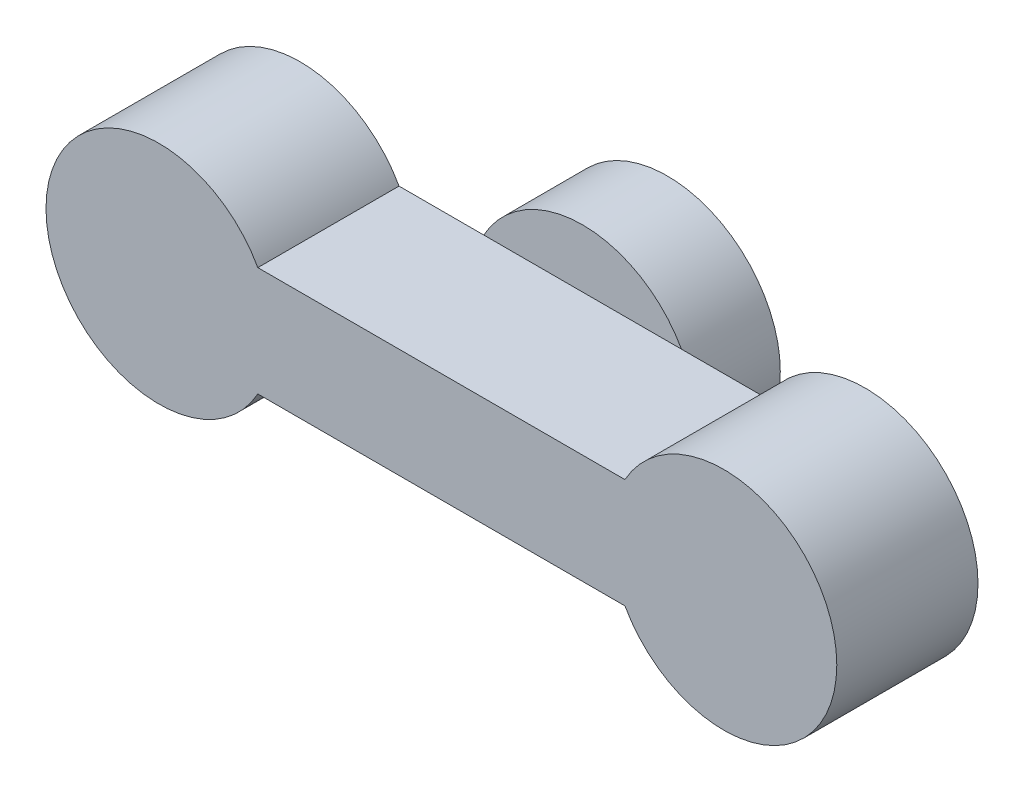
ISO-10303-21;
HEADER;
FILE_DESCRIPTION(('STEP AP214'),'2;1');
FILE_NAME('part.step','',(''),(''),'','','');
FILE_SCHEMA(('AUTOMOTIVE_DESIGN { 1 0 10303 214 1 1 1 1 }'));
ENDSEC;
DATA;
#1=APPLICATION_CONTEXT('core data for automotive mechanical design processes');
#2=APPLICATION_PROTOCOL_DEFINITION('international standard','automotive_design',2000,#1);
#3=PRODUCT_CONTEXT('',#1,'mechanical');
#4=PRODUCT('Part','Part','',(#3));
#5=PRODUCT_RELATED_PRODUCT_CATEGORY('part','',(#4));
#6=PRODUCT_DEFINITION_FORMATION('','',#4);
#7=PRODUCT_DEFINITION_CONTEXT('part definition',#1,'design');
#8=PRODUCT_DEFINITION('design','',#6,#7);
#9=PRODUCT_DEFINITION_SHAPE('','',#8);
#10=(LENGTH_UNIT() NAMED_UNIT(*) SI_UNIT(.MILLI.,.METRE.));
#11=(NAMED_UNIT(*) PLANE_ANGLE_UNIT() SI_UNIT($,.RADIAN.));
#12=(NAMED_UNIT(*) SI_UNIT($,.STERADIAN.) SOLID_ANGLE_UNIT());
#13=UNCERTAINTY_MEASURE_WITH_UNIT(LENGTH_MEASURE(1.E-05),#10,'distance_accuracy_value','');
#14=(GEOMETRIC_REPRESENTATION_CONTEXT(3) GLOBAL_UNCERTAINTY_ASSIGNED_CONTEXT((#13)) GLOBAL_UNIT_ASSIGNED_CONTEXT((#10,
#11,#12)) REPRESENTATION_CONTEXT('',''));
#15=CARTESIAN_POINT('',(0.,0.,0.));
#16=DIRECTION('',(0.,0.,1.));
#17=DIRECTION('',(1.,0.,0.));
#18=AXIS2_PLACEMENT_3D('',#15,#16,#17);
#19=CARTESIAN_POINT('',(0.,0.,1.5));
#20=DIRECTION('',(0.,0.,1.));
#21=DIRECTION('',(1.,0.,0.));
#22=AXIS2_PLACEMENT_3D('',#19,#20,#21);
#23=PLANE('',#22);
#24=DIRECTION('',(-1.,0.,0.));
#25=VECTOR('',#24,1.);
#26=CARTESIAN_POINT('',(3.25,0.968245836551854,1.5));
#27=LINE('',#26,#25);
#28=CARTESIAN_POINT('',(1.75,0.968245836551854,1.5));
#29=VERTEX_POINT('',#28);
#30=CARTESIAN_POINT('',(-1.75,0.968245836551854,1.5));
#31=VERTEX_POINT('',#30);
#32=EDGE_CURVE('E11',#29,#31,#27,.T.);
#33=ORIENTED_EDGE('',*,*,#32,.F.);
#34=CARTESIAN_POINT('',(0.,0.,1.5));
#35=DIRECTION('',(0.,0.,1.));
#36=DIRECTION('',(1.,0.,0.));
#37=AXIS2_PLACEMENT_3D('',#34,#35,#36);
#38=CIRCLE('',#37,2.);
#39=EDGE_CURVE('E136',#29,#31,#38,.T.);
#40=ORIENTED_EDGE('',*,*,#39,.T.);
#41=EDGE_LOOP('',(#33,#40));
#42=FACE_BOUND('',#41,.T.);
#43=ADVANCED_FACE('F43',(#42),#23,.T.);
#44=CARTESIAN_POINT('',(0.,0.,0.));
#45=DIRECTION('',(0.,0.,1.));
#46=DIRECTION('',(1.,0.,0.));
#47=AXIS2_PLACEMENT_3D('',#44,#45,#46);
#48=PLANE('',#47);
#49=CARTESIAN_POINT('',(0.,0.,0.));
#50=DIRECTION('',(0.,0.,1.));
#51=DIRECTION('',(1.,0.,0.));
#52=AXIS2_PLACEMENT_3D('',#49,#50,#51);
#53=CIRCLE('',#52,2.);
#54=CARTESIAN_POINT('',(2.,0.,0.));
#55=VERTEX_POINT('',#54);
#56=EDGE_CURVE('E47',#55,#55,#53,.T.);
#57=ORIENTED_EDGE('',*,*,#56,.F.);
#58=EDGE_LOOP('',(#57));
#59=FACE_BOUND('',#58,.T.);
#60=CARTESIAN_POINT('',(0.,0.,0.));
#61=DIRECTION('',(0.,0.,1.));
#62=DIRECTION('',(1.,0.,0.));
#63=AXIS2_PLACEMENT_3D('',#60,#61,#62);
#64=CIRCLE('',#63,1.);
#65=CARTESIAN_POINT('',(1.,0.,0.));
#66=VERTEX_POINT('',#65);
#67=EDGE_CURVE('E145',#66,#66,#64,.T.);
#68=ORIENTED_EDGE('',*,*,#67,.T.);
#69=EDGE_LOOP('',(#68));
#70=FACE_BOUND('',#69,.T.);
#71=ADVANCED_FACE('F208',(#59,#70),#48,.F.);
#72=CARTESIAN_POINT('',(0.,0.,1.));
#73=DIRECTION('',(0.,0.,-1.));
#74=DIRECTION('',(-1.,0.,0.));
#75=AXIS2_PLACEMENT_3D('',#72,#73,#74);
#76=CYLINDRICAL_SURFACE('',#75,2.);
#77=ORIENTED_EDGE('',*,*,#56,.T.);
#78=EDGE_LOOP('',(#77));
#79=FACE_BOUND('',#78,.T.);
#80=ORIENTED_EDGE('',*,*,#39,.F.);
#81=CARTESIAN_POINT('',(1.75,-0.968245836551854,1.5));
#82=VERTEX_POINT('',#81);
#83=EDGE_CURVE('E129',#82,#29,#38,.T.);
#84=ORIENTED_EDGE('',*,*,#83,.F.);
#85=CARTESIAN_POINT('',(-1.75,-0.968245836551854,1.5));
#86=VERTEX_POINT('',#85);
#87=EDGE_CURVE('E134',#86,#82,#38,.T.);
#88=ORIENTED_EDGE('',*,*,#87,.F.);
#89=EDGE_CURVE('E68',#31,#86,#38,.T.);
#90=ORIENTED_EDGE('',*,*,#89,.F.);
#91=EDGE_LOOP('',(#80,#84,#88,#90));
#92=FACE_BOUND('',#91,.T.);
#93=ADVANCED_FACE('F45',(#79,#92),#76,.T.);
#94=CARTESIAN_POINT('',(0.,0.,1.));
#95=DIRECTION('',(0.,0.,-1.));
#96=DIRECTION('',(-1.,0.,0.));
#97=AXIS2_PLACEMENT_3D('',#94,#95,#96);
#98=CYLINDRICAL_SURFACE('',#97,1.);
#99=CARTESIAN_POINT('',(0.,0.,1.));
#100=DIRECTION('',(0.,0.,1.));
#101=DIRECTION('',(1.,0.,0.));
#102=AXIS2_PLACEMENT_3D('',#99,#100,#101);
#103=CIRCLE('',#102,1.);
#104=CARTESIAN_POINT('',(1.,0.,1.));
#105=VERTEX_POINT('',#104);
#106=EDGE_CURVE('E142',#105,#105,#103,.T.);
#107=ORIENTED_EDGE('',*,*,#106,.T.);
#108=EDGE_LOOP('',(#107));
#109=FACE_BOUND('',#108,.T.);
#110=ORIENTED_EDGE('',*,*,#67,.F.);
#111=EDGE_LOOP('',(#110));
#112=FACE_BOUND('',#111,.T.);
#113=ADVANCED_FACE('F203',(#109,#112),#98,.F.);
#114=CARTESIAN_POINT('',(0.,0.,1.));
#115=DIRECTION('',(0.,0.,1.));
#116=DIRECTION('',(1.,0.,0.));
#117=AXIS2_PLACEMENT_3D('',#114,#115,#116);
#118=PLANE('',#117);
#119=ORIENTED_EDGE('',*,*,#106,.F.);
#120=EDGE_LOOP('',(#119));
#121=FACE_BOUND('',#120,.T.);
#122=ADVANCED_FACE('F196',(#121),#118,.F.);
#123=DIRECTION('',(1.,0.,0.));
#124=VECTOR('',#123,1.);
#125=CARTESIAN_POINT('',(3.25,-0.968245836551854,1.5));
#126=LINE('',#125,#124);
#127=EDGE_CURVE('E53',#86,#82,#126,.T.);
#128=ORIENTED_EDGE('',*,*,#127,.F.);
#129=ORIENTED_EDGE('',*,*,#87,.T.);
#130=EDGE_LOOP('',(#128,#129));
#131=FACE_BOUND('',#130,.T.);
#132=ADVANCED_FACE('F194',(#131),#23,.T.);
#133=CARTESIAN_POINT('',(-5.,0.,1.5));
#134=DIRECTION('',(0.,0.,1.));
#135=DIRECTION('',(1.,0.,0.));
#136=AXIS2_PLACEMENT_3D('',#133,#134,#135);
#137=PLANE('',#136);
#138=CARTESIAN_POINT('',(-3.25,0.968245836551854,1.5));
#139=VERTEX_POINT('',#138);
#140=EDGE_CURVE('E56',#31,#139,#27,.T.);
#141=ORIENTED_EDGE('',*,*,#140,.F.);
#142=ORIENTED_EDGE('',*,*,#89,.T.);
#143=CARTESIAN_POINT('',(-3.25,-0.968245836551854,1.5));
#144=VERTEX_POINT('',#143);
#145=EDGE_CURVE('E156',#144,#86,#126,.T.);
#146=ORIENTED_EDGE('',*,*,#145,.F.);
#147=CARTESIAN_POINT('',(-5.,0.,1.5));
#148=DIRECTION('',(0.,0.,1.));
#149=DIRECTION('',(1.,0.,0.));
#150=AXIS2_PLACEMENT_3D('',#147,#148,#149);
#151=CIRCLE('',#150,2.);
#152=EDGE_CURVE('E127',#139,#144,#151,.T.);
#153=ORIENTED_EDGE('',*,*,#152,.F.);
#154=EDGE_LOOP('',(#141,#142,#146,#153));
#155=FACE_BOUND('',#154,.T.);
#156=ADVANCED_FACE('F191',(#155),#137,.F.);
#157=CARTESIAN_POINT('',(3.25,-0.968245836551854,1.5));
#158=VERTEX_POINT('',#157);
#159=EDGE_CURVE('E157',#82,#158,#126,.T.);
#160=ORIENTED_EDGE('',*,*,#159,.F.);
#161=ORIENTED_EDGE('',*,*,#83,.T.);
#162=CARTESIAN_POINT('',(3.25,0.968245836551854,1.5));
#163=VERTEX_POINT('',#162);
#164=EDGE_CURVE('E55',#163,#29,#27,.T.);
#165=ORIENTED_EDGE('',*,*,#164,.F.);
#166=CARTESIAN_POINT('',(5.,0.,1.5));
#167=DIRECTION('',(0.,0.,1.));
#168=DIRECTION('',(1.,0.,0.));
#169=AXIS2_PLACEMENT_3D('',#166,#167,#168);
#170=CIRCLE('',#169,2.);
#171=EDGE_CURVE('E161',#158,#163,#170,.T.);
#172=ORIENTED_EDGE('',*,*,#171,.F.);
#173=EDGE_LOOP('',(#160,#161,#165,#172));
#174=FACE_BOUND('',#173,.T.);
#175=ADVANCED_FACE('F187',(#174),#137,.F.);
#176=CARTESIAN_POINT('',(-5.,0.,4.));
#177=DIRECTION('',(0.,0.,-1.));
#178=DIRECTION('',(-1.,0.,0.));
#179=AXIS2_PLACEMENT_3D('',#176,#177,#178);
#180=CYLINDRICAL_SURFACE('',#179,2.);
#181=ORIENTED_EDGE('',*,*,#152,.T.);
#182=DIRECTION('',(0.,0.,-1.));
#183=VECTOR('',#182,1.);
#184=CARTESIAN_POINT('',(-3.25,-0.968245836551854,4.));
#185=LINE('',#184,#183);
#186=CARTESIAN_POINT('',(-3.25,-0.968245836551854,4.));
#187=VERTEX_POINT('',#186);
#188=EDGE_CURVE('E106',#187,#144,#185,.T.);
#189=ORIENTED_EDGE('',*,*,#188,.F.);
#190=CARTESIAN_POINT('',(-5.,0.,4.));
#191=DIRECTION('',(0.,0.,1.));
#192=DIRECTION('',(1.,0.,0.));
#193=AXIS2_PLACEMENT_3D('',#190,#191,#192);
#194=CIRCLE('',#193,2.);
#195=CARTESIAN_POINT('',(-3.25,0.968245836551854,4.));
#196=VERTEX_POINT('',#195);
#197=EDGE_CURVE('E114',#196,#187,#194,.T.);
#198=ORIENTED_EDGE('',*,*,#197,.F.);
#199=DIRECTION('',(0.,0.,-1.));
#200=VECTOR('',#199,1.);
#201=CARTESIAN_POINT('',(-3.25,0.968245836551854,4.));
#202=LINE('',#201,#200);
#203=EDGE_CURVE('E168',#196,#139,#202,.T.);
#204=ORIENTED_EDGE('',*,*,#203,.T.);
#205=EDGE_LOOP('',(#181,#189,#198,#204));
#206=FACE_BOUND('',#205,.T.);
#207=ADVANCED_FACE('F125',(#206),#180,.T.);
#208=CARTESIAN_POINT('',(3.25,-0.968245836551854,4.));
#209=DIRECTION('',(0.,1.,0.));
#210=DIRECTION('',(0.,0.,1.));
#211=AXIS2_PLACEMENT_3D('',#208,#209,#210);
#212=PLANE('',#211);
#213=ORIENTED_EDGE('',*,*,#145,.T.);
#214=ORIENTED_EDGE('',*,*,#127,.T.);
#215=ORIENTED_EDGE('',*,*,#159,.T.);
#216=DIRECTION('',(0.,0.,-1.));
#217=VECTOR('',#216,1.);
#218=CARTESIAN_POINT('',(3.25,-0.968245836551854,4.));
#219=LINE('',#218,#217);
#220=CARTESIAN_POINT('',(3.25,-0.968245836551854,4.));
#221=VERTEX_POINT('',#220);
#222=EDGE_CURVE('E109',#221,#158,#219,.T.);
#223=ORIENTED_EDGE('',*,*,#222,.F.);
#224=DIRECTION('',(1.,0.,0.));
#225=VECTOR('',#224,1.);
#226=CARTESIAN_POINT('',(3.25,-0.968245836551854,4.));
#227=LINE('',#226,#225);
#228=EDGE_CURVE('E101',#187,#221,#227,.T.);
#229=ORIENTED_EDGE('',*,*,#228,.F.);
#230=ORIENTED_EDGE('',*,*,#188,.T.);
#231=EDGE_LOOP('',(#213,#214,#215,#223,#229,#230));
#232=FACE_BOUND('',#231,.T.);
#233=ADVANCED_FACE('F104',(#232),#212,.F.);
#234=CARTESIAN_POINT('',(5.,0.,4.));
#235=DIRECTION('',(0.,0.,-1.));
#236=DIRECTION('',(-1.,0.,0.));
#237=AXIS2_PLACEMENT_3D('',#234,#235,#236);
#238=CYLINDRICAL_SURFACE('',#237,2.);
#239=ORIENTED_EDGE('',*,*,#171,.T.);
#240=DIRECTION('',(0.,0.,-1.));
#241=VECTOR('',#240,1.);
#242=CARTESIAN_POINT('',(3.25,0.968245836551854,4.));
#243=LINE('',#242,#241);
#244=CARTESIAN_POINT('',(3.25,0.968245836551854,4.));
#245=VERTEX_POINT('',#244);
#246=EDGE_CURVE('E137',#245,#163,#243,.T.);
#247=ORIENTED_EDGE('',*,*,#246,.F.);
#248=CARTESIAN_POINT('',(5.,0.,4.));
#249=DIRECTION('',(0.,0.,1.));
#250=DIRECTION('',(1.,0.,0.));
#251=AXIS2_PLACEMENT_3D('',#248,#249,#250);
#252=CIRCLE('',#251,2.);
#253=EDGE_CURVE('E113',#221,#245,#252,.T.);
#254=ORIENTED_EDGE('',*,*,#253,.F.);
#255=ORIENTED_EDGE('',*,*,#222,.T.);
#256=EDGE_LOOP('',(#239,#247,#254,#255));
#257=FACE_BOUND('',#256,.T.);
#258=ADVANCED_FACE('F173',(#257),#238,.T.);
#259=CARTESIAN_POINT('',(3.25,0.968245836551854,4.));
#260=DIRECTION('',(0.,-1.,0.));
#261=DIRECTION('',(0.,0.,-1.));
#262=AXIS2_PLACEMENT_3D('',#259,#260,#261);
#263=PLANE('',#262);
#264=ORIENTED_EDGE('',*,*,#164,.T.);
#265=ORIENTED_EDGE('',*,*,#32,.T.);
#266=ORIENTED_EDGE('',*,*,#140,.T.);
#267=ORIENTED_EDGE('',*,*,#203,.F.);
#268=DIRECTION('',(-1.,0.,0.));
#269=VECTOR('',#268,1.);
#270=CARTESIAN_POINT('',(3.25,0.968245836551854,4.));
#271=LINE('',#270,#269);
#272=EDGE_CURVE('E119',#245,#196,#271,.T.);
#273=ORIENTED_EDGE('',*,*,#272,.F.);
#274=ORIENTED_EDGE('',*,*,#246,.T.);
#275=EDGE_LOOP('',(#264,#265,#266,#267,#273,#274));
#276=FACE_BOUND('',#275,.T.);
#277=ADVANCED_FACE('F179',(#276),#263,.F.);
#278=CARTESIAN_POINT('',(-5.,0.,4.));
#279=DIRECTION('',(0.,0.,1.));
#280=DIRECTION('',(1.,0.,0.));
#281=AXIS2_PLACEMENT_3D('',#278,#279,#280);
#282=PLANE('',#281);
#283=ORIENTED_EDGE('',*,*,#197,.T.);
#284=ORIENTED_EDGE('',*,*,#228,.T.);
#285=ORIENTED_EDGE('',*,*,#253,.T.);
#286=ORIENTED_EDGE('',*,*,#272,.T.);
#287=EDGE_LOOP('',(#283,#284,#285,#286));
#288=FACE_BOUND('',#287,.T.);
#289=ADVANCED_FACE('F117',(#288),#282,.T.);
#290=CLOSED_SHELL('',(#43,#71,#93,#113,#122,#132,#156,#175,#207,#233,#258,#277,#289));
#291=MANIFOLD_SOLID_BREP('B2',#290);
#292=ADVANCED_BREP_SHAPE_REPRESENTATION('',(#18,#291),#14);
#293=SHAPE_DEFINITION_REPRESENTATION(#9,#292);
ENDSEC;
END-ISO-10303-21;
